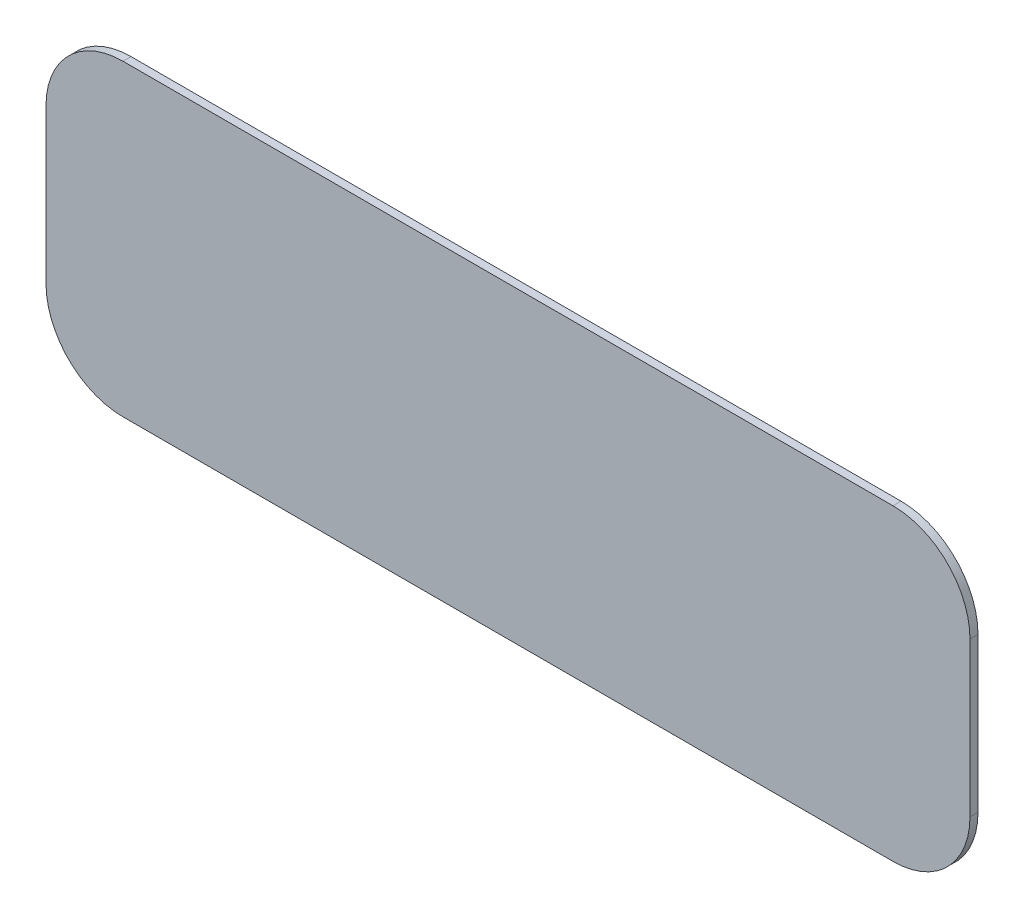
ISO-10303-21;
HEADER;
FILE_DESCRIPTION(('STEP AP214'),'2;1');
FILE_NAME('part.step','',(''),(''),'','','');
FILE_SCHEMA(('AUTOMOTIVE_DESIGN { 1 0 10303 214 1 1 1 1 }'));
ENDSEC;
DATA;
#1=APPLICATION_CONTEXT('core data for automotive mechanical design processes');
#2=APPLICATION_PROTOCOL_DEFINITION('international standard','automotive_design',2000,#1);
#3=PRODUCT_CONTEXT('',#1,'mechanical');
#4=PRODUCT('Part','Part','',(#3));
#5=PRODUCT_RELATED_PRODUCT_CATEGORY('part','',(#4));
#6=PRODUCT_DEFINITION_FORMATION('','',#4);
#7=PRODUCT_DEFINITION_CONTEXT('part definition',#1,'design');
#8=PRODUCT_DEFINITION('design','',#6,#7);
#9=PRODUCT_DEFINITION_SHAPE('','',#8);
#10=(LENGTH_UNIT() NAMED_UNIT(*) SI_UNIT(.MILLI.,.METRE.));
#11=(NAMED_UNIT(*) PLANE_ANGLE_UNIT() SI_UNIT($,.RADIAN.));
#12=(NAMED_UNIT(*) SI_UNIT($,.STERADIAN.) SOLID_ANGLE_UNIT());
#13=UNCERTAINTY_MEASURE_WITH_UNIT(LENGTH_MEASURE(1.E-05),#10,'distance_accuracy_value','');
#14=(GEOMETRIC_REPRESENTATION_CONTEXT(3) GLOBAL_UNCERTAINTY_ASSIGNED_CONTEXT((#13)) GLOBAL_UNIT_ASSIGNED_CONTEXT((#10,
#11,#12)) REPRESENTATION_CONTEXT('',''));
#15=CARTESIAN_POINT('',(0.,0.,0.));
#16=DIRECTION('',(0.,0.,1.));
#17=DIRECTION('',(1.,0.,0.));
#18=AXIS2_PLACEMENT_3D('',#15,#16,#17);
#19=CARTESIAN_POINT('',(-76.2,15.24,1.5875));
#20=DIRECTION('',(0.,0.,-1.));
#21=DIRECTION('',(-1.,0.,0.));
#22=AXIS2_PLACEMENT_3D('',#19,#20,#21);
#23=CYLINDRICAL_SURFACE('',#22,15.24);
#24=CARTESIAN_POINT('',(-76.2,15.24,0.));
#25=DIRECTION('',(0.,0.,-1.));
#26=DIRECTION('',(-1.,0.,0.));
#27=AXIS2_PLACEMENT_3D('',#24,#25,#26);
#28=CIRCLE('',#27,15.24);
#29=CARTESIAN_POINT('',(-91.44,15.24,0.));
#30=VERTEX_POINT('',#29);
#31=CARTESIAN_POINT('',(-76.2,30.48,0.));
#32=VERTEX_POINT('',#31);
#33=EDGE_CURVE('E130',#30,#32,#28,.T.);
#34=ORIENTED_EDGE('',*,*,#33,.F.);
#35=DIRECTION('',(0.,0.,-1.));
#36=VECTOR('',#35,1.);
#37=CARTESIAN_POINT('',(-91.44,15.24,1.5875));
#38=LINE('',#37,#36);
#39=CARTESIAN_POINT('',(-91.44,15.24,1.5875));
#40=VERTEX_POINT('',#39);
#41=EDGE_CURVE('E11',#40,#30,#38,.T.);
#42=ORIENTED_EDGE('',*,*,#41,.F.);
#43=CARTESIAN_POINT('',(-76.2,15.24,1.5875));
#44=DIRECTION('',(0.,0.,-1.));
#45=DIRECTION('',(-1.,0.,0.));
#46=AXIS2_PLACEMENT_3D('',#43,#44,#45);
#47=CIRCLE('',#46,15.24);
#48=CARTESIAN_POINT('',(-76.2,30.48,1.5875));
#49=VERTEX_POINT('',#48);
#50=EDGE_CURVE('E149',#40,#49,#47,.T.);
#51=ORIENTED_EDGE('',*,*,#50,.T.);
#52=DIRECTION('',(0.,0.,-1.));
#53=VECTOR('',#52,1.);
#54=CARTESIAN_POINT('',(-76.2,30.48,1.5875));
#55=LINE('',#54,#53);
#56=EDGE_CURVE('E36',#49,#32,#55,.T.);
#57=ORIENTED_EDGE('',*,*,#56,.T.);
#58=EDGE_LOOP('',(#34,#42,#51,#57));
#59=FACE_BOUND('',#58,.T.);
#60=ADVANCED_FACE('F33',(#59),#23,.T.);
#61=CARTESIAN_POINT('',(-91.44,-15.24,1.5875));
#62=DIRECTION('',(-1.,0.,0.));
#63=DIRECTION('',(0.,0.,1.));
#64=AXIS2_PLACEMENT_3D('',#61,#62,#63);
#65=PLANE('',#64);
#66=DIRECTION('',(0.,1.,0.));
#67=VECTOR('',#66,1.);
#68=CARTESIAN_POINT('',(-91.44,-15.24,0.));
#69=LINE('',#68,#67);
#70=CARTESIAN_POINT('',(-91.44,-15.24,0.));
#71=VERTEX_POINT('',#70);
#72=EDGE_CURVE('E147',#71,#30,#69,.T.);
#73=ORIENTED_EDGE('',*,*,#72,.F.);
#74=DIRECTION('',(0.,0.,-1.));
#75=VECTOR('',#74,1.);
#76=CARTESIAN_POINT('',(-91.44,-15.24,1.5875));
#77=LINE('',#76,#75);
#78=CARTESIAN_POINT('',(-91.44,-15.24,1.5875));
#79=VERTEX_POINT('',#78);
#80=EDGE_CURVE('E42',#79,#71,#77,.T.);
#81=ORIENTED_EDGE('',*,*,#80,.F.);
#82=DIRECTION('',(0.,1.,0.));
#83=VECTOR('',#82,1.);
#84=CARTESIAN_POINT('',(-91.44,-15.24,1.5875));
#85=LINE('',#84,#83);
#86=EDGE_CURVE('E110',#79,#40,#85,.T.);
#87=ORIENTED_EDGE('',*,*,#86,.T.);
#88=ORIENTED_EDGE('',*,*,#41,.T.);
#89=EDGE_LOOP('',(#73,#81,#87,#88));
#90=FACE_BOUND('',#89,.T.);
#91=ADVANCED_FACE('F163',(#90),#65,.T.);
#92=CARTESIAN_POINT('',(-76.2,-15.24,1.5875));
#93=DIRECTION('',(0.,0.,-1.));
#94=DIRECTION('',(-1.,0.,0.));
#95=AXIS2_PLACEMENT_3D('',#92,#93,#94);
#96=CYLINDRICAL_SURFACE('',#95,15.24);
#97=CARTESIAN_POINT('',(-76.2,-15.24,0.));
#98=DIRECTION('',(0.,0.,1.));
#99=DIRECTION('',(1.,0.,0.));
#100=AXIS2_PLACEMENT_3D('',#97,#98,#99);
#101=CIRCLE('',#100,15.24);
#102=CARTESIAN_POINT('',(-76.2,-30.48,0.));
#103=VERTEX_POINT('',#102);
#104=EDGE_CURVE('E115',#71,#103,#101,.T.);
#105=ORIENTED_EDGE('',*,*,#104,.T.);
#106=DIRECTION('',(0.,0.,-1.));
#107=VECTOR('',#106,1.);
#108=CARTESIAN_POINT('',(-76.2,-30.48,1.5875));
#109=LINE('',#108,#107);
#110=CARTESIAN_POINT('',(-76.2,-30.48,1.5875));
#111=VERTEX_POINT('',#110);
#112=EDGE_CURVE('E113',#111,#103,#109,.T.);
#113=ORIENTED_EDGE('',*,*,#112,.F.);
#114=CARTESIAN_POINT('',(-76.2,-15.24,1.5875));
#115=DIRECTION('',(0.,0.,1.));
#116=DIRECTION('',(1.,0.,0.));
#117=AXIS2_PLACEMENT_3D('',#114,#115,#116);
#118=CIRCLE('',#117,15.24);
#119=EDGE_CURVE('E103',#79,#111,#118,.T.);
#120=ORIENTED_EDGE('',*,*,#119,.F.);
#121=ORIENTED_EDGE('',*,*,#80,.T.);
#122=EDGE_LOOP('',(#105,#113,#120,#121));
#123=FACE_BOUND('',#122,.T.);
#124=ADVANCED_FACE('F114',(#123),#96,.T.);
#125=CARTESIAN_POINT('',(-76.2,-30.48,1.5875));
#126=DIRECTION('',(0.,1.,0.));
#127=DIRECTION('',(0.,0.,1.));
#128=AXIS2_PLACEMENT_3D('',#125,#126,#127);
#129=PLANE('',#128);
#130=DIRECTION('',(1.,0.,0.));
#131=VECTOR('',#130,1.);
#132=CARTESIAN_POINT('',(-76.2,-30.48,0.));
#133=LINE('',#132,#131);
#134=CARTESIAN_POINT('',(76.2,-30.48,0.));
#135=VERTEX_POINT('',#134);
#136=EDGE_CURVE('E144',#103,#135,#133,.T.);
#137=ORIENTED_EDGE('',*,*,#136,.T.);
#138=DIRECTION('',(0.,0.,-1.));
#139=VECTOR('',#138,1.);
#140=CARTESIAN_POINT('',(76.2,-30.48,1.5875));
#141=LINE('',#140,#139);
#142=CARTESIAN_POINT('',(76.2,-30.48,1.5875));
#143=VERTEX_POINT('',#142);
#144=EDGE_CURVE('E119',#143,#135,#141,.T.);
#145=ORIENTED_EDGE('',*,*,#144,.F.);
#146=DIRECTION('',(1.,0.,0.));
#147=VECTOR('',#146,1.);
#148=CARTESIAN_POINT('',(-76.2,-30.48,1.5875));
#149=LINE('',#148,#147);
#150=EDGE_CURVE('E108',#111,#143,#149,.T.);
#151=ORIENTED_EDGE('',*,*,#150,.F.);
#152=ORIENTED_EDGE('',*,*,#112,.T.);
#153=EDGE_LOOP('',(#137,#145,#151,#152));
#154=FACE_BOUND('',#153,.T.);
#155=ADVANCED_FACE('F121',(#154),#129,.F.);
#156=CARTESIAN_POINT('',(76.2,-15.24,1.5875));
#157=DIRECTION('',(0.,0.,-1.));
#158=DIRECTION('',(-1.,0.,0.));
#159=AXIS2_PLACEMENT_3D('',#156,#157,#158);
#160=CYLINDRICAL_SURFACE('',#159,15.24);
#161=CARTESIAN_POINT('',(76.2,-15.24,0.));
#162=DIRECTION('',(0.,0.,-1.));
#163=DIRECTION('',(-1.,0.,0.));
#164=AXIS2_PLACEMENT_3D('',#161,#162,#163);
#165=CIRCLE('',#164,15.24);
#166=CARTESIAN_POINT('',(91.44,-15.24,0.));
#167=VERTEX_POINT('',#166);
#168=EDGE_CURVE('E141',#167,#135,#165,.T.);
#169=ORIENTED_EDGE('',*,*,#168,.F.);
#170=DIRECTION('',(0.,0.,-1.));
#171=VECTOR('',#170,1.);
#172=CARTESIAN_POINT('',(91.44,-15.24,1.5875));
#173=LINE('',#172,#171);
#174=CARTESIAN_POINT('',(91.44,-15.24,1.5875));
#175=VERTEX_POINT('',#174);
#176=EDGE_CURVE('E153',#175,#167,#173,.T.);
#177=ORIENTED_EDGE('',*,*,#176,.F.);
#178=CARTESIAN_POINT('',(76.2,-15.24,1.5875));
#179=DIRECTION('',(0.,0.,-1.));
#180=DIRECTION('',(-1.,0.,0.));
#181=AXIS2_PLACEMENT_3D('',#178,#179,#180);
#182=CIRCLE('',#181,15.24);
#183=EDGE_CURVE('E123',#175,#143,#182,.T.);
#184=ORIENTED_EDGE('',*,*,#183,.T.);
#185=ORIENTED_EDGE('',*,*,#144,.T.);
#186=EDGE_LOOP('',(#169,#177,#184,#185));
#187=FACE_BOUND('',#186,.T.);
#188=ADVANCED_FACE('F176',(#187),#160,.T.);
#189=CARTESIAN_POINT('',(91.44,-15.24,1.5875));
#190=DIRECTION('',(-1.,0.,0.));
#191=DIRECTION('',(0.,0.,1.));
#192=AXIS2_PLACEMENT_3D('',#189,#190,#191);
#193=PLANE('',#192);
#194=DIRECTION('',(0.,1.,0.));
#195=VECTOR('',#194,1.);
#196=CARTESIAN_POINT('',(91.44,-15.24,0.));
#197=LINE('',#196,#195);
#198=CARTESIAN_POINT('',(91.44,15.24,0.));
#199=VERTEX_POINT('',#198);
#200=EDGE_CURVE('E139',#167,#199,#197,.T.);
#201=ORIENTED_EDGE('',*,*,#200,.T.);
#202=DIRECTION('',(0.,0.,-1.));
#203=VECTOR('',#202,1.);
#204=CARTESIAN_POINT('',(91.44,15.24,1.5875));
#205=LINE('',#204,#203);
#206=CARTESIAN_POINT('',(91.44,15.24,1.5875));
#207=VERTEX_POINT('',#206);
#208=EDGE_CURVE('E155',#207,#199,#205,.T.);
#209=ORIENTED_EDGE('',*,*,#208,.F.);
#210=DIRECTION('',(0.,1.,0.));
#211=VECTOR('',#210,1.);
#212=CARTESIAN_POINT('',(91.44,-15.24,1.5875));
#213=LINE('',#212,#211);
#214=EDGE_CURVE('E125',#175,#207,#213,.T.);
#215=ORIENTED_EDGE('',*,*,#214,.F.);
#216=ORIENTED_EDGE('',*,*,#176,.T.);
#217=EDGE_LOOP('',(#201,#209,#215,#216));
#218=FACE_BOUND('',#217,.T.);
#219=ADVANCED_FACE('F179',(#218),#193,.F.);
#220=CARTESIAN_POINT('',(76.2,15.24,1.5875));
#221=DIRECTION('',(0.,0.,-1.));
#222=DIRECTION('',(-1.,0.,0.));
#223=AXIS2_PLACEMENT_3D('',#220,#221,#222);
#224=CYLINDRICAL_SURFACE('',#223,15.24);
#225=CARTESIAN_POINT('',(76.2,15.24,0.));
#226=DIRECTION('',(0.,0.,1.));
#227=DIRECTION('',(1.,0.,0.));
#228=AXIS2_PLACEMENT_3D('',#225,#226,#227);
#229=CIRCLE('',#228,15.24);
#230=CARTESIAN_POINT('',(76.2,30.48,0.));
#231=VERTEX_POINT('',#230);
#232=EDGE_CURVE('E136',#199,#231,#229,.T.);
#233=ORIENTED_EDGE('',*,*,#232,.T.);
#234=DIRECTION('',(0.,0.,-1.));
#235=VECTOR('',#234,1.);
#236=CARTESIAN_POINT('',(76.2,30.48,1.5875));
#237=LINE('',#236,#235);
#238=CARTESIAN_POINT('',(76.2,30.48,1.5875));
#239=VERTEX_POINT('',#238);
#240=EDGE_CURVE('E157',#239,#231,#237,.T.);
#241=ORIENTED_EDGE('',*,*,#240,.F.);
#242=CARTESIAN_POINT('',(76.2,15.24,1.5875));
#243=DIRECTION('',(0.,0.,1.));
#244=DIRECTION('',(1.,0.,0.));
#245=AXIS2_PLACEMENT_3D('',#242,#243,#244);
#246=CIRCLE('',#245,15.24);
#247=EDGE_CURVE('E253',#207,#239,#246,.T.);
#248=ORIENTED_EDGE('',*,*,#247,.F.);
#249=ORIENTED_EDGE('',*,*,#208,.T.);
#250=EDGE_LOOP('',(#233,#241,#248,#249));
#251=FACE_BOUND('',#250,.T.);
#252=ADVANCED_FACE('F183',(#251),#224,.T.);
#253=CARTESIAN_POINT('',(-76.2,30.48,1.5875));
#254=DIRECTION('',(0.,1.,0.));
#255=DIRECTION('',(-1.,0.,0.));
#256=AXIS2_PLACEMENT_3D('',#253,#254,#255);
#257=PLANE('',#256);
#258=DIRECTION('',(1.,0.,0.));
#259=VECTOR('',#258,1.);
#260=CARTESIAN_POINT('',(-76.2,30.48,0.));
#261=LINE('',#260,#259);
#262=EDGE_CURVE('E133',#32,#231,#261,.T.);
#263=ORIENTED_EDGE('',*,*,#262,.F.);
#264=ORIENTED_EDGE('',*,*,#56,.F.);
#265=DIRECTION('',(1.,0.,0.));
#266=VECTOR('',#265,1.);
#267=CARTESIAN_POINT('',(-76.2,30.48,1.5875));
#268=LINE('',#267,#266);
#269=EDGE_CURVE('E254',#49,#239,#268,.T.);
#270=ORIENTED_EDGE('',*,*,#269,.T.);
#271=ORIENTED_EDGE('',*,*,#240,.T.);
#272=EDGE_LOOP('',(#263,#264,#270,#271));
#273=FACE_BOUND('',#272,.T.);
#274=ADVANCED_FACE('F159',(#273),#257,.T.);
#275=CARTESIAN_POINT('',(-76.2,15.24,1.5875));
#276=DIRECTION('',(0.,0.,-1.));
#277=DIRECTION('',(-1.,0.,0.));
#278=AXIS2_PLACEMENT_3D('',#275,#276,#277);
#279=PLANE('',#278);
#280=ORIENTED_EDGE('',*,*,#50,.F.);
#281=ORIENTED_EDGE('',*,*,#86,.F.);
#282=ORIENTED_EDGE('',*,*,#119,.T.);
#283=ORIENTED_EDGE('',*,*,#150,.T.);
#284=ORIENTED_EDGE('',*,*,#183,.F.);
#285=ORIENTED_EDGE('',*,*,#214,.T.);
#286=ORIENTED_EDGE('',*,*,#247,.T.);
#287=ORIENTED_EDGE('',*,*,#269,.F.);
#288=EDGE_LOOP('',(#280,#281,#282,#283,#284,#285,#286,#287));
#289=FACE_BOUND('',#288,.T.);
#290=ADVANCED_FACE('F105',(#289),#279,.F.);
#291=CARTESIAN_POINT('',(-76.2,15.24,0.));
#292=DIRECTION('',(0.,0.,-1.));
#293=DIRECTION('',(-1.,0.,0.));
#294=AXIS2_PLACEMENT_3D('',#291,#292,#293);
#295=PLANE('',#294);
#296=ORIENTED_EDGE('',*,*,#33,.T.);
#297=ORIENTED_EDGE('',*,*,#262,.T.);
#298=ORIENTED_EDGE('',*,*,#232,.F.);
#299=ORIENTED_EDGE('',*,*,#200,.F.);
#300=ORIENTED_EDGE('',*,*,#168,.T.);
#301=ORIENTED_EDGE('',*,*,#136,.F.);
#302=ORIENTED_EDGE('',*,*,#104,.F.);
#303=ORIENTED_EDGE('',*,*,#72,.T.);
#304=EDGE_LOOP('',(#296,#297,#298,#299,#300,#301,#302,#303));
#305=FACE_BOUND('',#304,.T.);
#306=ADVANCED_FACE('F162',(#305),#295,.T.);
#307=CLOSED_SHELL('',(#60,#91,#124,#155,#188,#219,#252,#274,#290,#306));
#308=MANIFOLD_SOLID_BREP('B2',#307);
#309=ADVANCED_BREP_SHAPE_REPRESENTATION('',(#18,#308),#14);
#310=SHAPE_DEFINITION_REPRESENTATION(#9,#309);
ENDSEC;
END-ISO-10303-21;
